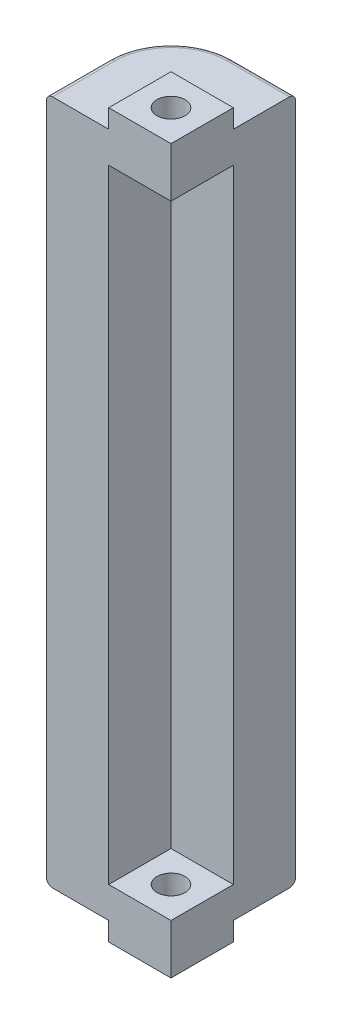
ISO-10303-21;
HEADER;
FILE_DESCRIPTION(('STEP AP214'),'2;1');
FILE_NAME('part.step','',(''),(''),'','','');
FILE_SCHEMA(('AUTOMOTIVE_DESIGN { 1 0 10303 214 1 1 1 1 }'));
ENDSEC;
DATA;
#1=APPLICATION_CONTEXT('core data for automotive mechanical design processes');
#2=APPLICATION_PROTOCOL_DEFINITION('international standard','automotive_design',2000,#1);
#3=PRODUCT_CONTEXT('',#1,'mechanical');
#4=PRODUCT('Part','Part','',(#3));
#5=PRODUCT_RELATED_PRODUCT_CATEGORY('part','',(#4));
#6=PRODUCT_DEFINITION_FORMATION('','',#4);
#7=PRODUCT_DEFINITION_CONTEXT('part definition',#1,'design');
#8=PRODUCT_DEFINITION('design','',#6,#7);
#9=PRODUCT_DEFINITION_SHAPE('','',#8);
#10=(LENGTH_UNIT() NAMED_UNIT(*) SI_UNIT(.MILLI.,.METRE.));
#11=(NAMED_UNIT(*) PLANE_ANGLE_UNIT() SI_UNIT($,.RADIAN.));
#12=(NAMED_UNIT(*) SI_UNIT($,.STERADIAN.) SOLID_ANGLE_UNIT());
#13=UNCERTAINTY_MEASURE_WITH_UNIT(LENGTH_MEASURE(1.E-05),#10,'distance_accuracy_value','');
#14=(GEOMETRIC_REPRESENTATION_CONTEXT(3) GLOBAL_UNCERTAINTY_ASSIGNED_CONTEXT((#13)) GLOBAL_UNIT_ASSIGNED_CONTEXT((#10,
#11,#12)) REPRESENTATION_CONTEXT('',''));
#15=CARTESIAN_POINT('',(0.,0.,0.));
#16=DIRECTION('',(0.,0.,1.));
#17=DIRECTION('',(1.,0.,0.));
#18=AXIS2_PLACEMENT_3D('',#15,#16,#17);
#19=CARTESIAN_POINT('',(0.,55.,20.));
#20=DIRECTION('',(1.,0.,0.));
#21=DIRECTION('',(0.,0.,-1.));
#22=AXIS2_PLACEMENT_3D('',#19,#20,#21);
#23=PLANE('',#22);
#24=DIRECTION('',(0.,-1.,0.));
#25=VECTOR('',#24,1.);
#26=CARTESIAN_POINT('',(0.,55.,20.));
#27=LINE('',#26,#25);
#28=CARTESIAN_POINT('',(0.,54.,20.));
#29=VERTEX_POINT('',#28);
#30=CARTESIAN_POINT('',(0.,-54.,20.));
#31=VERTEX_POINT('',#30);
#32=EDGE_CURVE('E323',#29,#31,#27,.T.);
#33=ORIENTED_EDGE('',*,*,#32,.F.);
#34=DIRECTION('',(0.,0.,1.));
#35=VECTOR('',#34,1.);
#36=CARTESIAN_POINT('',(0.,54.,20.));
#37=LINE('',#36,#35);
#38=CARTESIAN_POINT('',(0.,54.,10.));
#39=VERTEX_POINT('',#38);
#40=EDGE_CURVE('E354',#29,#39,#37,.F.);
#41=ORIENTED_EDGE('',*,*,#40,.T.);
#42=DIRECTION('',(0.,-1.,0.));
#43=VECTOR('',#42,1.);
#44=CARTESIAN_POINT('',(0.,55.,10.));
#45=LINE('',#44,#43);
#46=CARTESIAN_POINT('',(0.,-54.,10.));
#47=VERTEX_POINT('',#46);
#48=EDGE_CURVE('E327',#39,#47,#45,.T.);
#49=ORIENTED_EDGE('',*,*,#48,.T.);
#50=DIRECTION('',(0.,0.,1.));
#51=VECTOR('',#50,1.);
#52=CARTESIAN_POINT('',(0.,-54.,20.));
#53=LINE('',#52,#51);
#54=EDGE_CURVE('E351',#47,#31,#53,.T.);
#55=ORIENTED_EDGE('',*,*,#54,.T.);
#56=EDGE_LOOP('',(#33,#41,#49,#55));
#57=FACE_BOUND('',#56,.T.);
#58=ADVANCED_FACE('F38',(#57),#23,.F.);
#59=CARTESIAN_POINT('',(10.,55.,20.));
#60=DIRECTION('',(0.,0.,-1.));
#61=DIRECTION('',(-1.,0.,0.));
#62=AXIS2_PLACEMENT_3D('',#59,#60,#61);
#63=PLANE('',#62);
#64=DIRECTION('',(1.,0.,0.));
#65=VECTOR('',#64,1.);
#66=CARTESIAN_POINT('',(10.,55.,20.));
#67=LINE('',#66,#65);
#68=CARTESIAN_POINT('',(0.999999999999999,55.,20.));
#69=VERTEX_POINT('',#68);
#70=CARTESIAN_POINT('',(10.,55.,20.));
#71=VERTEX_POINT('',#70);
#72=EDGE_CURVE('E282',#69,#71,#67,.T.);
#73=ORIENTED_EDGE('',*,*,#72,.F.);
#74=CARTESIAN_POINT('',(1.,54.,20.));
#75=DIRECTION('',(0.,0.,-1.));
#76=DIRECTION('',(-1.,0.,0.));
#77=AXIS2_PLACEMENT_3D('',#74,#75,#76);
#78=CIRCLE('',#77,1.);
#79=EDGE_CURVE('E348',#69,#29,#78,.F.);
#80=ORIENTED_EDGE('',*,*,#79,.T.);
#81=ORIENTED_EDGE('',*,*,#32,.T.);
#82=CARTESIAN_POINT('',(1.,-54.,20.));
#83=DIRECTION('',(0.,0.,-1.));
#84=DIRECTION('',(-1.,0.,0.));
#85=AXIS2_PLACEMENT_3D('',#82,#83,#84);
#86=CIRCLE('',#85,1.);
#87=CARTESIAN_POINT('',(0.999999999999999,-55.,20.));
#88=VERTEX_POINT('',#87);
#89=EDGE_CURVE('E345',#31,#88,#86,.F.);
#90=ORIENTED_EDGE('',*,*,#89,.T.);
#91=DIRECTION('',(1.,0.,0.));
#92=VECTOR('',#91,1.);
#93=CARTESIAN_POINT('',(10.,-55.,20.));
#94=LINE('',#93,#92);
#95=CARTESIAN_POINT('',(10.,-55.,20.));
#96=VERTEX_POINT('',#95);
#97=EDGE_CURVE('E281',#88,#96,#94,.T.);
#98=ORIENTED_EDGE('',*,*,#97,.T.);
#99=DIRECTION('',(0.,-1.,0.));
#100=VECTOR('',#99,1.);
#101=CARTESIAN_POINT('',(10.,-50.,20.));
#102=LINE('',#101,#100);
#103=CARTESIAN_POINT('',(10.,-58.,20.));
#104=VERTEX_POINT('',#103);
#105=EDGE_CURVE('E228',#96,#104,#102,.T.);
#106=ORIENTED_EDGE('',*,*,#105,.T.);
#107=DIRECTION('',(-1.,0.,0.));
#108=VECTOR('',#107,1.);
#109=CARTESIAN_POINT('',(20.,-58.,20.));
#110=LINE('',#109,#108);
#111=CARTESIAN_POINT('',(20.,-58.,20.));
#112=VERTEX_POINT('',#111);
#113=EDGE_CURVE('E210',#112,#104,#110,.T.);
#114=ORIENTED_EDGE('',*,*,#113,.F.);
#115=DIRECTION('',(0.,-1.,0.));
#116=VECTOR('',#115,1.);
#117=CARTESIAN_POINT('',(20.,-50.,20.));
#118=LINE('',#117,#116);
#119=CARTESIAN_POINT('',(20.,-50.,20.));
#120=VERTEX_POINT('',#119);
#121=EDGE_CURVE('E197',#120,#112,#118,.T.);
#122=ORIENTED_EDGE('',*,*,#121,.F.);
#123=DIRECTION('',(-1.,0.,0.));
#124=VECTOR('',#123,1.);
#125=CARTESIAN_POINT('',(20.,-50.,20.));
#126=LINE('',#125,#124);
#127=CARTESIAN_POINT('',(10.,-50.,20.));
#128=VERTEX_POINT('',#127);
#129=EDGE_CURVE('E222',#120,#128,#126,.T.);
#130=ORIENTED_EDGE('',*,*,#129,.T.);
#131=DIRECTION('',(0.,-1.,0.));
#132=VECTOR('',#131,1.);
#133=CARTESIAN_POINT('',(10.,55.,20.));
#134=LINE('',#133,#132);
#135=CARTESIAN_POINT('',(10.,50.,20.));
#136=VERTEX_POINT('',#135);
#137=EDGE_CURVE('E320',#136,#128,#134,.T.);
#138=ORIENTED_EDGE('',*,*,#137,.F.);
#139=DIRECTION('',(-1.,0.,0.));
#140=VECTOR('',#139,1.);
#141=CARTESIAN_POINT('',(20.,50.,20.));
#142=LINE('',#141,#140);
#143=CARTESIAN_POINT('',(20.,50.,20.));
#144=VERTEX_POINT('',#143);
#145=EDGE_CURVE('E260',#144,#136,#142,.T.);
#146=ORIENTED_EDGE('',*,*,#145,.F.);
#147=DIRECTION('',(0.,1.,0.));
#148=VECTOR('',#147,1.);
#149=CARTESIAN_POINT('',(20.,50.,20.));
#150=LINE('',#149,#148);
#151=CARTESIAN_POINT('',(20.,58.,20.));
#152=VERTEX_POINT('',#151);
#153=EDGE_CURVE('E278',#144,#152,#150,.T.);
#154=ORIENTED_EDGE('',*,*,#153,.T.);
#155=DIRECTION('',(-1.,0.,0.));
#156=VECTOR('',#155,1.);
#157=CARTESIAN_POINT('',(20.,58.,20.));
#158=LINE('',#157,#156);
#159=CARTESIAN_POINT('',(10.,58.,20.));
#160=VERTEX_POINT('',#159);
#161=EDGE_CURVE('E244',#152,#160,#158,.T.);
#162=ORIENTED_EDGE('',*,*,#161,.T.);
#163=DIRECTION('',(0.,1.,0.));
#164=VECTOR('',#163,1.);
#165=CARTESIAN_POINT('',(10.,50.,20.));
#166=LINE('',#165,#164);
#167=EDGE_CURVE('E275',#71,#160,#166,.T.);
#168=ORIENTED_EDGE('',*,*,#167,.F.);
#169=EDGE_LOOP('',(#73,#80,#81,#90,#98,#106,#114,#122,#130,#138,#146,#154,#162,#168));
#170=FACE_BOUND('',#169,.T.);
#171=ADVANCED_FACE('F405',(#170),#63,.F.);
#172=CARTESIAN_POINT('',(10.,55.,10.));
#173=DIRECTION('',(-1.,0.,0.));
#174=DIRECTION('',(0.,0.,1.));
#175=AXIS2_PLACEMENT_3D('',#172,#173,#174);
#176=PLANE('',#175);
#177=ORIENTED_EDGE('',*,*,#137,.T.);
#178=DIRECTION('',(0.,0.,-1.));
#179=VECTOR('',#178,1.);
#180=CARTESIAN_POINT('',(10.,-50.,20.));
#181=LINE('',#180,#179);
#182=CARTESIAN_POINT('',(10.,-50.,10.));
#183=VERTEX_POINT('',#182);
#184=EDGE_CURVE('E219',#128,#183,#181,.T.);
#185=ORIENTED_EDGE('',*,*,#184,.T.);
#186=DIRECTION('',(0.,-1.,0.));
#187=VECTOR('',#186,1.);
#188=CARTESIAN_POINT('',(10.,55.,10.));
#189=LINE('',#188,#187);
#190=CARTESIAN_POINT('',(10.,50.,10.));
#191=VERTEX_POINT('',#190);
#192=EDGE_CURVE('E316',#191,#183,#189,.T.);
#193=ORIENTED_EDGE('',*,*,#192,.F.);
#194=DIRECTION('',(0.,0.,-1.));
#195=VECTOR('',#194,1.);
#196=CARTESIAN_POINT('',(10.,50.,20.));
#197=LINE('',#196,#195);
#198=EDGE_CURVE('E263',#136,#191,#197,.T.);
#199=ORIENTED_EDGE('',*,*,#198,.F.);
#200=EDGE_LOOP('',(#177,#185,#193,#199));
#201=FACE_BOUND('',#200,.T.);
#202=ADVANCED_FACE('F455',(#201),#176,.F.);
#203=CARTESIAN_POINT('',(20.,55.,10.));
#204=DIRECTION('',(0.,0.,-1.));
#205=DIRECTION('',(-1.,0.,0.));
#206=AXIS2_PLACEMENT_3D('',#203,#204,#205);
#207=PLANE('',#206);
#208=ORIENTED_EDGE('',*,*,#192,.T.);
#209=DIRECTION('',(1.,0.,0.));
#210=VECTOR('',#209,1.);
#211=CARTESIAN_POINT('',(10.,-50.,10.));
#212=LINE('',#211,#210);
#213=CARTESIAN_POINT('',(20.,-50.,10.));
#214=VERTEX_POINT('',#213);
#215=EDGE_CURVE('E216',#183,#214,#212,.T.);
#216=ORIENTED_EDGE('',*,*,#215,.T.);
#217=DIRECTION('',(0.,-1.,0.));
#218=VECTOR('',#217,1.);
#219=CARTESIAN_POINT('',(20.,55.,10.));
#220=LINE('',#219,#218);
#221=CARTESIAN_POINT('',(20.,50.,10.));
#222=VERTEX_POINT('',#221);
#223=EDGE_CURVE('E312',#222,#214,#220,.T.);
#224=ORIENTED_EDGE('',*,*,#223,.F.);
#225=DIRECTION('',(1.,0.,0.));
#226=VECTOR('',#225,1.);
#227=CARTESIAN_POINT('',(10.,50.,10.));
#228=LINE('',#227,#226);
#229=EDGE_CURVE('E266',#191,#222,#228,.T.);
#230=ORIENTED_EDGE('',*,*,#229,.F.);
#231=EDGE_LOOP('',(#208,#216,#224,#230));
#232=FACE_BOUND('',#231,.T.);
#233=ADVANCED_FACE('F452',(#232),#207,.F.);
#234=CARTESIAN_POINT('',(20.,55.,0.));
#235=DIRECTION('',(-1.,0.,0.));
#236=DIRECTION('',(0.,0.,1.));
#237=AXIS2_PLACEMENT_3D('',#234,#235,#236);
#238=PLANE('',#237);
#239=DIRECTION('',(0.,0.,-1.));
#240=VECTOR('',#239,1.);
#241=CARTESIAN_POINT('',(20.,-55.,0.));
#242=LINE('',#241,#240);
#243=CARTESIAN_POINT('',(20.,-55.,10.));
#244=VERTEX_POINT('',#243);
#245=CARTESIAN_POINT('',(20.,-55.,1.));
#246=VERTEX_POINT('',#245);
#247=EDGE_CURVE('E286',#244,#246,#242,.T.);
#248=ORIENTED_EDGE('',*,*,#247,.T.);
#249=CARTESIAN_POINT('',(20.,-54.,1.));
#250=DIRECTION('',(-1.,0.,0.));
#251=DIRECTION('',(0.,0.,1.));
#252=AXIS2_PLACEMENT_3D('',#249,#250,#251);
#253=CIRCLE('',#252,1.);
#254=CARTESIAN_POINT('',(20.,-54.,0.));
#255=VERTEX_POINT('',#254);
#256=EDGE_CURVE('E11',#246,#255,#253,.F.);
#257=ORIENTED_EDGE('',*,*,#256,.T.);
#258=DIRECTION('',(0.,-1.,0.));
#259=VECTOR('',#258,1.);
#260=CARTESIAN_POINT('',(20.,55.,0.));
#261=LINE('',#260,#259);
#262=CARTESIAN_POINT('',(20.,54.,0.));
#263=VERTEX_POINT('',#262);
#264=EDGE_CURVE('E298',#263,#255,#261,.T.);
#265=ORIENTED_EDGE('',*,*,#264,.F.);
#266=CARTESIAN_POINT('',(20.,54.,1.));
#267=DIRECTION('',(-1.,0.,0.));
#268=DIRECTION('',(0.,0.,1.));
#269=AXIS2_PLACEMENT_3D('',#266,#267,#268);
#270=CIRCLE('',#269,1.);
#271=CARTESIAN_POINT('',(20.,55.,1.));
#272=VERTEX_POINT('',#271);
#273=EDGE_CURVE('E48',#263,#272,#270,.F.);
#274=ORIENTED_EDGE('',*,*,#273,.T.);
#275=DIRECTION('',(0.,0.,-1.));
#276=VECTOR('',#275,1.);
#277=CARTESIAN_POINT('',(20.,55.,0.));
#278=LINE('',#277,#276);
#279=CARTESIAN_POINT('',(20.,55.,10.));
#280=VERTEX_POINT('',#279);
#281=EDGE_CURVE('E294',#280,#272,#278,.T.);
#282=ORIENTED_EDGE('',*,*,#281,.F.);
#283=DIRECTION('',(0.,1.,0.));
#284=VECTOR('',#283,1.);
#285=CARTESIAN_POINT('',(20.,50.,10.));
#286=LINE('',#285,#284);
#287=CARTESIAN_POINT('',(20.,58.,10.));
#288=VERTEX_POINT('',#287);
#289=EDGE_CURVE('E269',#280,#288,#286,.T.);
#290=ORIENTED_EDGE('',*,*,#289,.T.);
#291=DIRECTION('',(0.,0.,1.));
#292=VECTOR('',#291,1.);
#293=CARTESIAN_POINT('',(20.,58.,10.));
#294=LINE('',#293,#292);
#295=EDGE_CURVE('E240',#288,#152,#294,.T.);
#296=ORIENTED_EDGE('',*,*,#295,.T.);
#297=ORIENTED_EDGE('',*,*,#153,.F.);
#298=DIRECTION('',(0.,0.,1.));
#299=VECTOR('',#298,1.);
#300=CARTESIAN_POINT('',(20.,50.,10.));
#301=LINE('',#300,#299);
#302=EDGE_CURVE('E256',#222,#144,#301,.T.);
#303=ORIENTED_EDGE('',*,*,#302,.F.);
#304=ORIENTED_EDGE('',*,*,#223,.T.);
#305=DIRECTION('',(0.,0.,1.));
#306=VECTOR('',#305,1.);
#307=CARTESIAN_POINT('',(20.,-50.,10.));
#308=LINE('',#307,#306);
#309=EDGE_CURVE('E213',#214,#120,#308,.T.);
#310=ORIENTED_EDGE('',*,*,#309,.T.);
#311=ORIENTED_EDGE('',*,*,#121,.T.);
#312=DIRECTION('',(0.,0.,1.));
#313=VECTOR('',#312,1.);
#314=CARTESIAN_POINT('',(20.,-58.,10.));
#315=LINE('',#314,#313);
#316=CARTESIAN_POINT('',(20.,-58.,10.));
#317=VERTEX_POINT('',#316);
#318=EDGE_CURVE('E190',#317,#112,#315,.T.);
#319=ORIENTED_EDGE('',*,*,#318,.F.);
#320=DIRECTION('',(0.,-1.,0.));
#321=VECTOR('',#320,1.);
#322=CARTESIAN_POINT('',(20.,-50.,10.));
#323=LINE('',#322,#321);
#324=EDGE_CURVE('E172',#244,#317,#323,.T.);
#325=ORIENTED_EDGE('',*,*,#324,.F.);
#326=EDGE_LOOP('',(#248,#257,#265,#274,#282,#290,#296,#297,#303,#304,#310,#311,#319,#325));
#327=FACE_BOUND('',#326,.T.);
#328=ADVANCED_FACE('F195',(#327),#238,.F.);
#329=CARTESIAN_POINT('',(0.,55.,0.));
#330=DIRECTION('',(0.,0.,1.));
#331=DIRECTION('',(1.,0.,0.));
#332=AXIS2_PLACEMENT_3D('',#329,#330,#331);
#333=PLANE('',#332);
#334=ORIENTED_EDGE('',*,*,#264,.T.);
#335=DIRECTION('',(-1.,0.,0.));
#336=VECTOR('',#335,1.);
#337=CARTESIAN_POINT('',(10.,-54.,0.));
#338=LINE('',#337,#336);
#339=CARTESIAN_POINT('',(10.,-54.,0.));
#340=VERTEX_POINT('',#339);
#341=EDGE_CURVE('E366',#255,#340,#338,.T.);
#342=ORIENTED_EDGE('',*,*,#341,.T.);
#343=DIRECTION('',(0.,-1.,0.));
#344=VECTOR('',#343,1.);
#345=CARTESIAN_POINT('',(10.,55.,0.));
#346=LINE('',#345,#344);
#347=CARTESIAN_POINT('',(10.,54.,0.));
#348=VERTEX_POINT('',#347);
#349=EDGE_CURVE('E331',#340,#348,#346,.F.);
#350=ORIENTED_EDGE('',*,*,#349,.T.);
#351=DIRECTION('',(-1.,0.,0.));
#352=VECTOR('',#351,1.);
#353=CARTESIAN_POINT('',(0.,54.,0.));
#354=LINE('',#353,#352);
#355=EDGE_CURVE('E363',#348,#263,#354,.F.);
#356=ORIENTED_EDGE('',*,*,#355,.T.);
#357=EDGE_LOOP('',(#334,#342,#350,#356));
#358=FACE_BOUND('',#357,.T.);
#359=ADVANCED_FACE('F425',(#358),#333,.F.);
#360=CARTESIAN_POINT('',(0.,55.,0.));
#361=DIRECTION('',(0.,-1.,0.));
#362=DIRECTION('',(0.,0.,-1.));
#363=AXIS2_PLACEMENT_3D('',#360,#361,#362);
#364=PLANE('',#363);
#365=CARTESIAN_POINT('',(10.,55.,10.));
#366=DIRECTION('',(0.,-1.,0.));
#367=DIRECTION('',(0.,0.,-1.));
#368=AXIS2_PLACEMENT_3D('',#365,#366,#367);
#369=CIRCLE('',#368,9.);
#370=CARTESIAN_POINT('',(10.,55.,1.));
#371=VERTEX_POINT('',#370);
#372=CARTESIAN_POINT('',(1.,55.,10.));
#373=VERTEX_POINT('',#372);
#374=EDGE_CURVE('E338',#371,#373,#369,.F.);
#375=ORIENTED_EDGE('',*,*,#374,.T.);
#376=DIRECTION('',(0.,0.,1.));
#377=VECTOR('',#376,1.);
#378=CARTESIAN_POINT('',(1.,55.,0.));
#379=LINE('',#378,#377);
#380=EDGE_CURVE('E341',#373,#69,#379,.T.);
#381=ORIENTED_EDGE('',*,*,#380,.T.);
#382=ORIENTED_EDGE('',*,*,#72,.T.);
#383=DIRECTION('',(0.,0.,-1.));
#384=VECTOR('',#383,1.);
#385=CARTESIAN_POINT('',(10.,55.,10.));
#386=LINE('',#385,#384);
#387=CARTESIAN_POINT('',(10.,55.,10.));
#388=VERTEX_POINT('',#387);
#389=EDGE_CURVE('E285',#71,#388,#386,.T.);
#390=ORIENTED_EDGE('',*,*,#389,.T.);
#391=DIRECTION('',(1.,0.,0.));
#392=VECTOR('',#391,1.);
#393=CARTESIAN_POINT('',(20.,55.,10.));
#394=LINE('',#393,#392);
#395=EDGE_CURVE('E290',#388,#280,#394,.T.);
#396=ORIENTED_EDGE('',*,*,#395,.T.);
#397=ORIENTED_EDGE('',*,*,#281,.T.);
#398=DIRECTION('',(-1.,0.,0.));
#399=VECTOR('',#398,1.);
#400=CARTESIAN_POINT('',(0.,55.,1.));
#401=LINE('',#400,#399);
#402=EDGE_CURVE('E335',#272,#371,#401,.T.);
#403=ORIENTED_EDGE('',*,*,#402,.T.);
#404=EDGE_LOOP('',(#375,#381,#382,#390,#396,#397,#403));
#405=FACE_BOUND('',#404,.T.);
#406=ADVANCED_FACE('F411',(#405),#364,.F.);
#407=CARTESIAN_POINT('',(0.,-55.,0.));
#408=DIRECTION('',(0.,-1.,0.));
#409=DIRECTION('',(0.,0.,-1.));
#410=AXIS2_PLACEMENT_3D('',#407,#408,#409);
#411=PLANE('',#410);
#412=CARTESIAN_POINT('',(10.,-55.,10.));
#413=DIRECTION('',(0.,-1.,0.));
#414=DIRECTION('',(0.,0.,-1.));
#415=AXIS2_PLACEMENT_3D('',#412,#413,#414);
#416=CIRCLE('',#415,9.);
#417=CARTESIAN_POINT('',(1.,-55.,10.));
#418=VERTEX_POINT('',#417);
#419=CARTESIAN_POINT('',(10.,-55.,1.));
#420=VERTEX_POINT('',#419);
#421=EDGE_CURVE('E56',#418,#420,#416,.T.);
#422=ORIENTED_EDGE('',*,*,#421,.T.);
#423=DIRECTION('',(-1.,0.,0.));
#424=VECTOR('',#423,1.);
#425=CARTESIAN_POINT('',(20.,-55.,1.));
#426=LINE('',#425,#424);
#427=EDGE_CURVE('E374',#420,#246,#426,.F.);
#428=ORIENTED_EDGE('',*,*,#427,.T.);
#429=ORIENTED_EDGE('',*,*,#247,.F.);
#430=DIRECTION('',(1.,0.,0.));
#431=VECTOR('',#430,1.);
#432=CARTESIAN_POINT('',(20.,-55.,10.));
#433=LINE('',#432,#431);
#434=CARTESIAN_POINT('',(10.,-55.,10.));
#435=VERTEX_POINT('',#434);
#436=EDGE_CURVE('E177',#435,#244,#433,.T.);
#437=ORIENTED_EDGE('',*,*,#436,.F.);
#438=DIRECTION('',(0.,0.,-1.));
#439=VECTOR('',#438,1.);
#440=CARTESIAN_POINT('',(10.,-55.,10.));
#441=LINE('',#440,#439);
#442=EDGE_CURVE('E301',#96,#435,#441,.T.);
#443=ORIENTED_EDGE('',*,*,#442,.F.);
#444=ORIENTED_EDGE('',*,*,#97,.F.);
#445=DIRECTION('',(0.,0.,1.));
#446=VECTOR('',#445,1.);
#447=CARTESIAN_POINT('',(1.,-55.,10.));
#448=LINE('',#447,#446);
#449=EDGE_CURVE('E61',#88,#418,#448,.F.);
#450=ORIENTED_EDGE('',*,*,#449,.T.);
#451=EDGE_LOOP('',(#422,#428,#429,#437,#443,#444,#450));
#452=FACE_BOUND('',#451,.T.);
#453=ADVANCED_FACE('F465',(#452),#411,.T.);
#454=CARTESIAN_POINT('',(10.,50.,20.));
#455=DIRECTION('',(1.,0.,0.));
#456=DIRECTION('',(0.,0.,-1.));
#457=AXIS2_PLACEMENT_3D('',#454,#455,#456);
#458=PLANE('',#457);
#459=DIRECTION('',(0.,1.,0.));
#460=VECTOR('',#459,1.);
#461=CARTESIAN_POINT('',(10.,50.,10.));
#462=LINE('',#461,#460);
#463=CARTESIAN_POINT('',(10.,58.,10.));
#464=VERTEX_POINT('',#463);
#465=EDGE_CURVE('E272',#388,#464,#462,.T.);
#466=ORIENTED_EDGE('',*,*,#465,.F.);
#467=ORIENTED_EDGE('',*,*,#389,.F.);
#468=ORIENTED_EDGE('',*,*,#167,.T.);
#469=DIRECTION('',(0.,0.,-1.));
#470=VECTOR('',#469,1.);
#471=CARTESIAN_POINT('',(10.,58.,20.));
#472=LINE('',#471,#470);
#473=EDGE_CURVE('E248',#160,#464,#472,.T.);
#474=ORIENTED_EDGE('',*,*,#473,.T.);
#475=EDGE_LOOP('',(#466,#467,#468,#474));
#476=FACE_BOUND('',#475,.T.);
#477=ADVANCED_FACE('F435',(#476),#458,.F.);
#478=CARTESIAN_POINT('',(10.,50.,10.));
#479=DIRECTION('',(0.,0.,1.));
#480=DIRECTION('',(1.,0.,0.));
#481=AXIS2_PLACEMENT_3D('',#478,#479,#480);
#482=PLANE('',#481);
#483=ORIENTED_EDGE('',*,*,#289,.F.);
#484=ORIENTED_EDGE('',*,*,#395,.F.);
#485=ORIENTED_EDGE('',*,*,#465,.T.);
#486=DIRECTION('',(1.,0.,0.));
#487=VECTOR('',#486,1.);
#488=CARTESIAN_POINT('',(10.,58.,10.));
#489=LINE('',#488,#487);
#490=EDGE_CURVE('E252',#464,#288,#489,.T.);
#491=ORIENTED_EDGE('',*,*,#490,.T.);
#492=EDGE_LOOP('',(#483,#484,#485,#491));
#493=FACE_BOUND('',#492,.T.);
#494=ADVANCED_FACE('F433',(#493),#482,.F.);
#495=CARTESIAN_POINT('',(0.,50.,0.));
#496=DIRECTION('',(0.,-1.,0.));
#497=DIRECTION('',(0.,0.,-1.));
#498=AXIS2_PLACEMENT_3D('',#495,#496,#497);
#499=PLANE('',#498);
#500=CARTESIAN_POINT('',(15.,50.,15.));
#501=DIRECTION('',(0.,-1.,0.));
#502=DIRECTION('',(0.,0.,-1.));
#503=AXIS2_PLACEMENT_3D('',#500,#501,#502);
#504=CIRCLE('',#503,2.24999999999999);
#505=CARTESIAN_POINT('',(15.,50.,12.75));
#506=VERTEX_POINT('',#505);
#507=EDGE_CURVE('E182',#506,#506,#504,.T.);
#508=ORIENTED_EDGE('',*,*,#507,.F.);
#509=EDGE_LOOP('',(#508));
#510=FACE_BOUND('',#509,.T.);
#511=ORIENTED_EDGE('',*,*,#302,.T.);
#512=ORIENTED_EDGE('',*,*,#145,.T.);
#513=ORIENTED_EDGE('',*,*,#198,.T.);
#514=ORIENTED_EDGE('',*,*,#229,.T.);
#515=EDGE_LOOP('',(#511,#512,#513,#514));
#516=FACE_BOUND('',#515,.T.);
#517=ADVANCED_FACE('F448',(#510,#516),#499,.T.);
#518=CARTESIAN_POINT('',(0.,58.,0.));
#519=DIRECTION('',(0.,-1.,0.));
#520=DIRECTION('',(0.,0.,-1.));
#521=AXIS2_PLACEMENT_3D('',#518,#519,#520);
#522=PLANE('',#521);
#523=CARTESIAN_POINT('',(15.,58.,15.));
#524=DIRECTION('',(0.,-1.,0.));
#525=DIRECTION('',(0.,0.,-1.));
#526=AXIS2_PLACEMENT_3D('',#523,#524,#525);
#527=CIRCLE('',#526,2.25);
#528=CARTESIAN_POINT('',(15.,58.,12.75));
#529=VERTEX_POINT('',#528);
#530=EDGE_CURVE('E236',#529,#529,#527,.T.);
#531=ORIENTED_EDGE('',*,*,#530,.T.);
#532=EDGE_LOOP('',(#531));
#533=FACE_BOUND('',#532,.T.);
#534=ORIENTED_EDGE('',*,*,#295,.F.);
#535=ORIENTED_EDGE('',*,*,#490,.F.);
#536=ORIENTED_EDGE('',*,*,#473,.F.);
#537=ORIENTED_EDGE('',*,*,#161,.F.);
#538=EDGE_LOOP('',(#534,#535,#536,#537));
#539=FACE_BOUND('',#538,.T.);
#540=ADVANCED_FACE('F441',(#533,#539),#522,.F.);
#541=CARTESIAN_POINT('',(15.,50.,15.));
#542=DIRECTION('',(0.,-1.,0.));
#543=DIRECTION('',(0.,0.,-1.));
#544=AXIS2_PLACEMENT_3D('',#541,#542,#543);
#545=CYLINDRICAL_SURFACE('',#544,2.24999999999999);
#546=ORIENTED_EDGE('',*,*,#530,.F.);
#547=EDGE_LOOP('',(#546));
#548=FACE_BOUND('',#547,.T.);
#549=ORIENTED_EDGE('',*,*,#507,.T.);
#550=EDGE_LOOP('',(#549));
#551=FACE_BOUND('',#550,.T.);
#552=ADVANCED_FACE('F566',(#548,#551),#545,.F.);
#553=CARTESIAN_POINT('',(10.,-50.,10.));
#554=DIRECTION('',(0.,0.,-1.));
#555=DIRECTION('',(-1.,0.,0.));
#556=AXIS2_PLACEMENT_3D('',#553,#554,#555);
#557=PLANE('',#556);
#558=DIRECTION('',(0.,-1.,0.));
#559=VECTOR('',#558,1.);
#560=CARTESIAN_POINT('',(10.,-50.,10.));
#561=LINE('',#560,#559);
#562=CARTESIAN_POINT('',(10.,-58.,10.));
#563=VERTEX_POINT('',#562);
#564=EDGE_CURVE('E183',#435,#563,#561,.T.);
#565=ORIENTED_EDGE('',*,*,#564,.F.);
#566=ORIENTED_EDGE('',*,*,#436,.T.);
#567=ORIENTED_EDGE('',*,*,#324,.T.);
#568=DIRECTION('',(1.,0.,0.));
#569=VECTOR('',#568,1.);
#570=CARTESIAN_POINT('',(10.,-58.,10.));
#571=LINE('',#570,#569);
#572=EDGE_CURVE('E176',#563,#317,#571,.T.);
#573=ORIENTED_EDGE('',*,*,#572,.F.);
#574=EDGE_LOOP('',(#565,#566,#567,#573));
#575=FACE_BOUND('',#574,.T.);
#576=ADVANCED_FACE('F175',(#575),#557,.T.);
#577=CARTESIAN_POINT('',(10.,-50.,20.));
#578=DIRECTION('',(-1.,0.,0.));
#579=DIRECTION('',(0.,0.,1.));
#580=AXIS2_PLACEMENT_3D('',#577,#578,#579);
#581=PLANE('',#580);
#582=ORIENTED_EDGE('',*,*,#105,.F.);
#583=ORIENTED_EDGE('',*,*,#442,.T.);
#584=ORIENTED_EDGE('',*,*,#564,.T.);
#585=DIRECTION('',(0.,0.,-1.));
#586=VECTOR('',#585,1.);
#587=CARTESIAN_POINT('',(10.,-58.,20.));
#588=LINE('',#587,#586);
#589=EDGE_CURVE('E192',#104,#563,#588,.T.);
#590=ORIENTED_EDGE('',*,*,#589,.F.);
#591=EDGE_LOOP('',(#582,#583,#584,#590));
#592=FACE_BOUND('',#591,.T.);
#593=ADVANCED_FACE('F463',(#592),#581,.T.);
#594=CARTESIAN_POINT('',(0.,-50.,0.));
#595=DIRECTION('',(0.,1.,0.));
#596=DIRECTION('',(0.,0.,-1.));
#597=AXIS2_PLACEMENT_3D('',#594,#595,#596);
#598=PLANE('',#597);
#599=CARTESIAN_POINT('',(15.,-50.,15.));
#600=DIRECTION('',(0.,1.,0.));
#601=DIRECTION('',(0.,0.,1.));
#602=AXIS2_PLACEMENT_3D('',#599,#600,#601);
#603=CIRCLE('',#602,2.24999999999999);
#604=CARTESIAN_POINT('',(15.,-50.,17.25));
#605=VERTEX_POINT('',#604);
#606=EDGE_CURVE('E204',#605,#605,#603,.T.);
#607=ORIENTED_EDGE('',*,*,#606,.F.);
#608=EDGE_LOOP('',(#607));
#609=FACE_BOUND('',#608,.T.);
#610=ORIENTED_EDGE('',*,*,#309,.F.);
#611=ORIENTED_EDGE('',*,*,#215,.F.);
#612=ORIENTED_EDGE('',*,*,#184,.F.);
#613=ORIENTED_EDGE('',*,*,#129,.F.);
#614=EDGE_LOOP('',(#610,#611,#612,#613));
#615=FACE_BOUND('',#614,.T.);
#616=ADVANCED_FACE('F460',(#609,#615),#598,.T.);
#617=CARTESIAN_POINT('',(0.,-58.,0.));
#618=DIRECTION('',(0.,1.,0.));
#619=DIRECTION('',(0.,0.,-1.));
#620=AXIS2_PLACEMENT_3D('',#617,#618,#619);
#621=PLANE('',#620);
#622=CARTESIAN_POINT('',(15.,-58.,15.));
#623=DIRECTION('',(0.,1.,0.));
#624=DIRECTION('',(0.,0.,1.));
#625=AXIS2_PLACEMENT_3D('',#622,#623,#624);
#626=CIRCLE('',#625,2.25);
#627=CARTESIAN_POINT('',(15.,-58.,17.25));
#628=VERTEX_POINT('',#627);
#629=EDGE_CURVE('E200',#628,#628,#626,.T.);
#630=ORIENTED_EDGE('',*,*,#629,.T.);
#631=EDGE_LOOP('',(#630));
#632=FACE_BOUND('',#631,.T.);
#633=ORIENTED_EDGE('',*,*,#318,.T.);
#634=ORIENTED_EDGE('',*,*,#113,.T.);
#635=ORIENTED_EDGE('',*,*,#589,.T.);
#636=ORIENTED_EDGE('',*,*,#572,.T.);
#637=EDGE_LOOP('',(#633,#634,#635,#636));
#638=FACE_BOUND('',#637,.T.);
#639=ADVANCED_FACE('F188',(#632,#638),#621,.F.);
#640=CARTESIAN_POINT('',(15.,-50.,15.));
#641=DIRECTION('',(0.,1.,0.));
#642=DIRECTION('',(0.,0.,1.));
#643=AXIS2_PLACEMENT_3D('',#640,#641,#642);
#644=CYLINDRICAL_SURFACE('',#643,2.24999999999999);
#645=ORIENTED_EDGE('',*,*,#629,.F.);
#646=EDGE_LOOP('',(#645));
#647=FACE_BOUND('',#646,.T.);
#648=ORIENTED_EDGE('',*,*,#606,.T.);
#649=EDGE_LOOP('',(#648));
#650=FACE_BOUND('',#649,.T.);
#651=ADVANCED_FACE('F485',(#647,#650),#644,.F.);
#652=CARTESIAN_POINT('',(10.,55.,10.));
#653=DIRECTION('',(0.,-1.,0.));
#654=DIRECTION('',(0.,0.,-1.));
#655=AXIS2_PLACEMENT_3D('',#652,#653,#654);
#656=CYLINDRICAL_SURFACE('',#655,10.);
#657=ORIENTED_EDGE('',*,*,#48,.F.);
#658=CARTESIAN_POINT('',(10.,54.,10.));
#659=DIRECTION('',(0.,-1.,0.));
#660=DIRECTION('',(0.,0.,-1.));
#661=AXIS2_PLACEMENT_3D('',#658,#659,#660);
#662=CIRCLE('',#661,10.);
#663=EDGE_CURVE('E360',#39,#348,#662,.T.);
#664=ORIENTED_EDGE('',*,*,#663,.T.);
#665=ORIENTED_EDGE('',*,*,#349,.F.);
#666=CARTESIAN_POINT('',(10.,-54.,10.));
#667=DIRECTION('',(0.,-1.,0.));
#668=DIRECTION('',(0.,0.,-1.));
#669=AXIS2_PLACEMENT_3D('',#666,#667,#668);
#670=CIRCLE('',#669,10.);
#671=EDGE_CURVE('E357',#340,#47,#670,.F.);
#672=ORIENTED_EDGE('',*,*,#671,.T.);
#673=EDGE_LOOP('',(#657,#664,#665,#672));
#674=FACE_BOUND('',#673,.T.);
#675=ADVANCED_FACE('F422',(#674),#656,.T.);
#676=CARTESIAN_POINT('',(0.,54.,1.));
#677=DIRECTION('',(-1.,0.,0.));
#678=DIRECTION('',(0.,0.,1.));
#679=AXIS2_PLACEMENT_3D('',#676,#677,#678);
#680=CYLINDRICAL_SURFACE('',#679,1.);
#681=ORIENTED_EDGE('',*,*,#273,.F.);
#682=ORIENTED_EDGE('',*,*,#355,.F.);
#683=CARTESIAN_POINT('',(10.,54.,1.));
#684=DIRECTION('',(-1.,0.,0.));
#685=DIRECTION('',(0.,0.,1.));
#686=AXIS2_PLACEMENT_3D('',#683,#684,#685);
#687=CIRCLE('',#686,1.);
#688=EDGE_CURVE('E383',#371,#348,#687,.T.);
#689=ORIENTED_EDGE('',*,*,#688,.F.);
#690=ORIENTED_EDGE('',*,*,#402,.F.);
#691=EDGE_LOOP('',(#681,#682,#689,#690));
#692=FACE_BOUND('',#691,.T.);
#693=ADVANCED_FACE('F429',(#692),#680,.T.);
#694=CARTESIAN_POINT('',(10.,54.,10.));
#695=DIRECTION('',(0.,-1.,0.));
#696=DIRECTION('',(0.,0.,-1.));
#697=AXIS2_PLACEMENT_3D('',#694,#695,#696);
#698=TOROIDAL_SURFACE('',#697,9.,1.);
#699=ORIENTED_EDGE('',*,*,#688,.T.);
#700=ORIENTED_EDGE('',*,*,#663,.F.);
#701=CARTESIAN_POINT('',(1.,54.,10.));
#702=DIRECTION('',(0.,0.,1.));
#703=DIRECTION('',(1.,0.,0.));
#704=AXIS2_PLACEMENT_3D('',#701,#702,#703);
#705=CIRCLE('',#704,1.);
#706=EDGE_CURVE('E379',#373,#39,#705,.T.);
#707=ORIENTED_EDGE('',*,*,#706,.F.);
#708=ORIENTED_EDGE('',*,*,#374,.F.);
#709=EDGE_LOOP('',(#699,#700,#707,#708));
#710=FACE_BOUND('',#709,.T.);
#711=ADVANCED_FACE('F419',(#710),#698,.T.);
#712=CARTESIAN_POINT('',(1.,54.,0.));
#713=DIRECTION('',(0.,0.,1.));
#714=DIRECTION('',(1.,0.,0.));
#715=AXIS2_PLACEMENT_3D('',#712,#713,#714);
#716=CYLINDRICAL_SURFACE('',#715,1.);
#717=ORIENTED_EDGE('',*,*,#706,.T.);
#718=ORIENTED_EDGE('',*,*,#40,.F.);
#719=ORIENTED_EDGE('',*,*,#79,.F.);
#720=ORIENTED_EDGE('',*,*,#380,.F.);
#721=EDGE_LOOP('',(#717,#718,#719,#720));
#722=FACE_BOUND('',#721,.T.);
#723=ADVANCED_FACE('F409',(#722),#716,.T.);
#724=CARTESIAN_POINT('',(1.,-54.,20.));
#725=DIRECTION('',(0.,0.,-1.));
#726=DIRECTION('',(-1.,0.,0.));
#727=AXIS2_PLACEMENT_3D('',#724,#725,#726);
#728=CYLINDRICAL_SURFACE('',#727,1.);
#729=ORIENTED_EDGE('',*,*,#89,.F.);
#730=ORIENTED_EDGE('',*,*,#54,.F.);
#731=CARTESIAN_POINT('',(1.,-54.,10.));
#732=DIRECTION('',(0.,0.,-1.));
#733=DIRECTION('',(-1.,0.,0.));
#734=AXIS2_PLACEMENT_3D('',#731,#732,#733);
#735=CIRCLE('',#734,1.);
#736=EDGE_CURVE('E42',#418,#47,#735,.T.);
#737=ORIENTED_EDGE('',*,*,#736,.F.);
#738=ORIENTED_EDGE('',*,*,#449,.F.);
#739=EDGE_LOOP('',(#729,#730,#737,#738));
#740=FACE_BOUND('',#739,.T.);
#741=ADVANCED_FACE('F40',(#740),#728,.T.);
#742=CARTESIAN_POINT('',(10.,-54.,10.));
#743=DIRECTION('',(0.,-1.,0.));
#744=DIRECTION('',(0.,0.,-1.));
#745=AXIS2_PLACEMENT_3D('',#742,#743,#744);
#746=TOROIDAL_SURFACE('',#745,9.,1.);
#747=ORIENTED_EDGE('',*,*,#736,.T.);
#748=ORIENTED_EDGE('',*,*,#671,.F.);
#749=CARTESIAN_POINT('',(10.,-54.,1.));
#750=DIRECTION('',(1.,0.,0.));
#751=DIRECTION('',(0.,0.,-1.));
#752=AXIS2_PLACEMENT_3D('',#749,#750,#751);
#753=CIRCLE('',#752,1.);
#754=EDGE_CURVE('E386',#420,#340,#753,.T.);
#755=ORIENTED_EDGE('',*,*,#754,.F.);
#756=ORIENTED_EDGE('',*,*,#421,.F.);
#757=EDGE_LOOP('',(#747,#748,#755,#756));
#758=FACE_BOUND('',#757,.T.);
#759=ADVANCED_FACE('F395',(#758),#746,.T.);
#760=CARTESIAN_POINT('',(0.,-54.,1.));
#761=DIRECTION('',(1.,0.,0.));
#762=DIRECTION('',(0.,0.,-1.));
#763=AXIS2_PLACEMENT_3D('',#760,#761,#762);
#764=CYLINDRICAL_SURFACE('',#763,1.);
#765=ORIENTED_EDGE('',*,*,#256,.F.);
#766=ORIENTED_EDGE('',*,*,#427,.F.);
#767=ORIENTED_EDGE('',*,*,#754,.T.);
#768=ORIENTED_EDGE('',*,*,#341,.F.);
#769=EDGE_LOOP('',(#765,#766,#767,#768));
#770=FACE_BOUND('',#769,.T.);
#771=ADVANCED_FACE('F467',(#770),#764,.T.);
#772=CLOSED_SHELL('',(#58,#171,#202,#233,#328,#359,#406,#453,#477,#494,#517,#540,#552,#576,#593,
#616,#639,#651,#675,#693,#711,#723,#741,#759,#771));
#773=MANIFOLD_SOLID_BREP('B2',#772);
#774=ADVANCED_BREP_SHAPE_REPRESENTATION('',(#18,#773),#14);
#775=SHAPE_DEFINITION_REPRESENTATION(#9,#774);
ENDSEC;
END-ISO-10303-21;
